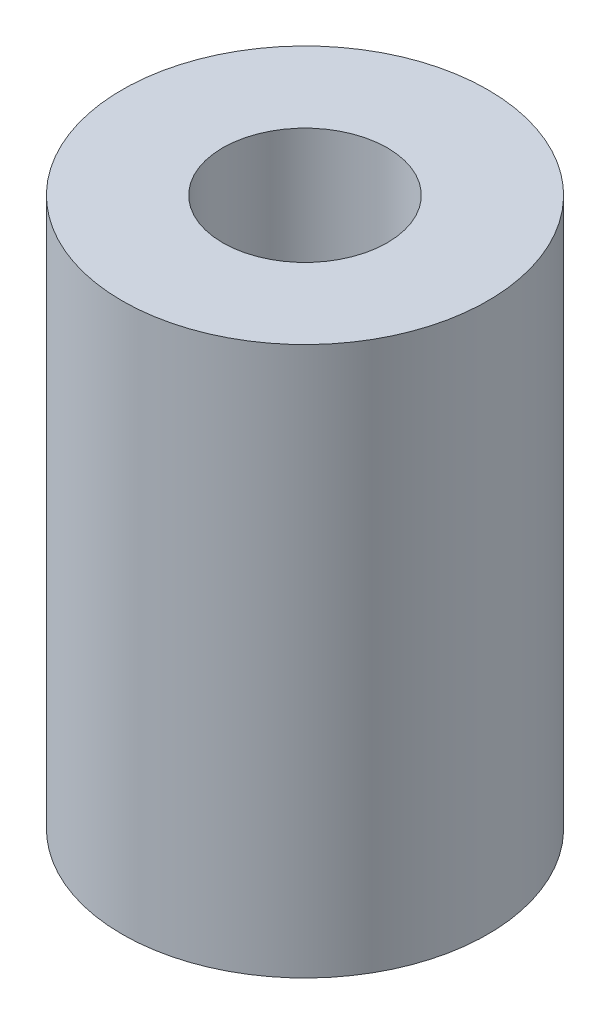
ISO-10303-21;
HEADER;
FILE_DESCRIPTION(('STEP AP214'),'2;1');
FILE_NAME('part.step','',(''),(''),'','','');
FILE_SCHEMA(('AUTOMOTIVE_DESIGN { 1 0 10303 214 1 1 1 1 }'));
ENDSEC;
DATA;
#1=APPLICATION_CONTEXT('core data for automotive mechanical design processes');
#2=APPLICATION_PROTOCOL_DEFINITION('international standard','automotive_design',2000,#1);
#3=PRODUCT_CONTEXT('',#1,'mechanical');
#4=PRODUCT('Part','Part','',(#3));
#5=PRODUCT_RELATED_PRODUCT_CATEGORY('part','',(#4));
#6=PRODUCT_DEFINITION_FORMATION('','',#4);
#7=PRODUCT_DEFINITION_CONTEXT('part definition',#1,'design');
#8=PRODUCT_DEFINITION('design','',#6,#7);
#9=PRODUCT_DEFINITION_SHAPE('','',#8);
#10=(LENGTH_UNIT() NAMED_UNIT(*) SI_UNIT(.MILLI.,.METRE.));
#11=(NAMED_UNIT(*) PLANE_ANGLE_UNIT() SI_UNIT($,.RADIAN.));
#12=(NAMED_UNIT(*) SI_UNIT($,.STERADIAN.) SOLID_ANGLE_UNIT());
#13=UNCERTAINTY_MEASURE_WITH_UNIT(LENGTH_MEASURE(1.E-05),#10,'distance_accuracy_value','');
#14=(GEOMETRIC_REPRESENTATION_CONTEXT(3) GLOBAL_UNCERTAINTY_ASSIGNED_CONTEXT((#13)) GLOBAL_UNIT_ASSIGNED_CONTEXT((#10,
#11,#12)) REPRESENTATION_CONTEXT('',''));
#15=CARTESIAN_POINT('',(0.,0.,0.));
#16=DIRECTION('',(0.,0.,1.));
#17=DIRECTION('',(1.,0.,0.));
#18=AXIS2_PLACEMENT_3D('',#15,#16,#17);
#19=CARTESIAN_POINT('',(5.,15.,0.));
#20=DIRECTION('',(0.,1.,0.));
#21=DIRECTION('',(0.,0.,1.));
#22=AXIS2_PLACEMENT_3D('',#19,#20,#21);
#23=PLANE('',#22);
#24=CARTESIAN_POINT('',(0.,15.,0.));
#25=DIRECTION('',(0.,-1.,0.));
#26=DIRECTION('',(0.,0.,-1.));
#27=AXIS2_PLACEMENT_3D('',#24,#25,#26);
#28=CIRCLE('',#27,2.25);
#29=CARTESIAN_POINT('',(0.,15.,-2.25));
#30=VERTEX_POINT('',#29);
#31=EDGE_CURVE('E44',#30,#30,#28,.T.);
#32=ORIENTED_EDGE('',*,*,#31,.T.);
#33=EDGE_LOOP('',(#32));
#34=FACE_BOUND('',#33,.T.);
#35=CARTESIAN_POINT('',(0.,15.,0.));
#36=DIRECTION('',(0.,-1.,0.));
#37=DIRECTION('',(0.,0.,-1.));
#38=AXIS2_PLACEMENT_3D('',#35,#36,#37);
#39=CIRCLE('',#38,5.);
#40=CARTESIAN_POINT('',(0.,15.,-5.));
#41=VERTEX_POINT('',#40);
#42=EDGE_CURVE('E10',#41,#41,#39,.T.);
#43=ORIENTED_EDGE('',*,*,#42,.F.);
#44=EDGE_LOOP('',(#43));
#45=FACE_BOUND('',#44,.T.);
#46=ADVANCED_FACE('F30',(#34,#45),#23,.T.);
#47=CARTESIAN_POINT('',(0.,0.,0.));
#48=DIRECTION('',(0.,-1.,0.));
#49=DIRECTION('',(0.,0.,-1.));
#50=AXIS2_PLACEMENT_3D('',#47,#48,#49);
#51=CYLINDRICAL_SURFACE('',#50,5.);
#52=ORIENTED_EDGE('',*,*,#42,.T.);
#53=EDGE_LOOP('',(#52));
#54=FACE_BOUND('',#53,.T.);
#55=CARTESIAN_POINT('',(0.,0.,0.));
#56=DIRECTION('',(0.,-1.,0.));
#57=DIRECTION('',(0.,0.,-1.));
#58=AXIS2_PLACEMENT_3D('',#55,#56,#57);
#59=CIRCLE('',#58,5.);
#60=CARTESIAN_POINT('',(0.,0.,-5.));
#61=VERTEX_POINT('',#60);
#62=EDGE_CURVE('E36',#61,#61,#59,.T.);
#63=ORIENTED_EDGE('',*,*,#62,.F.);
#64=EDGE_LOOP('',(#63));
#65=FACE_BOUND('',#64,.T.);
#66=ADVANCED_FACE('F60',(#54,#65),#51,.T.);
#67=CARTESIAN_POINT('',(2.24999999999997,0.,0.));
#68=DIRECTION('',(0.,-1.,0.));
#69=DIRECTION('',(0.,0.,-1.));
#70=AXIS2_PLACEMENT_3D('',#67,#68,#69);
#71=PLANE('',#70);
#72=ORIENTED_EDGE('',*,*,#62,.T.);
#73=EDGE_LOOP('',(#72));
#74=FACE_BOUND('',#73,.T.);
#75=CARTESIAN_POINT('',(0.,0.,0.));
#76=DIRECTION('',(0.,-1.,0.));
#77=DIRECTION('',(0.,0.,-1.));
#78=AXIS2_PLACEMENT_3D('',#75,#76,#77);
#79=CIRCLE('',#78,2.25);
#80=CARTESIAN_POINT('',(0.,0.,-2.25));
#81=VERTEX_POINT('',#80);
#82=EDGE_CURVE('E40',#81,#81,#79,.T.);
#83=ORIENTED_EDGE('',*,*,#82,.F.);
#84=EDGE_LOOP('',(#83));
#85=FACE_BOUND('',#84,.T.);
#86=ADVANCED_FACE('F54',(#74,#85),#71,.T.);
#87=CARTESIAN_POINT('',(0.,0.,0.));
#88=DIRECTION('',(0.,-1.,0.));
#89=DIRECTION('',(0.,0.,-1.));
#90=AXIS2_PLACEMENT_3D('',#87,#88,#89);
#91=CYLINDRICAL_SURFACE('',#90,2.25);
#92=ORIENTED_EDGE('',*,*,#82,.T.);
#93=EDGE_LOOP('',(#92));
#94=FACE_BOUND('',#93,.T.);
#95=ORIENTED_EDGE('',*,*,#31,.F.);
#96=EDGE_LOOP('',(#95));
#97=FACE_BOUND('',#96,.T.);
#98=ADVANCED_FACE('F52',(#94,#97),#91,.F.);
#99=CLOSED_SHELL('',(#46,#66,#86,#98));
#100=MANIFOLD_SOLID_BREP('B2',#99);
#101=ADVANCED_BREP_SHAPE_REPRESENTATION('',(#18,#100),#14);
#102=SHAPE_DEFINITION_REPRESENTATION(#9,#101);
ENDSEC;
END-ISO-10303-21;
